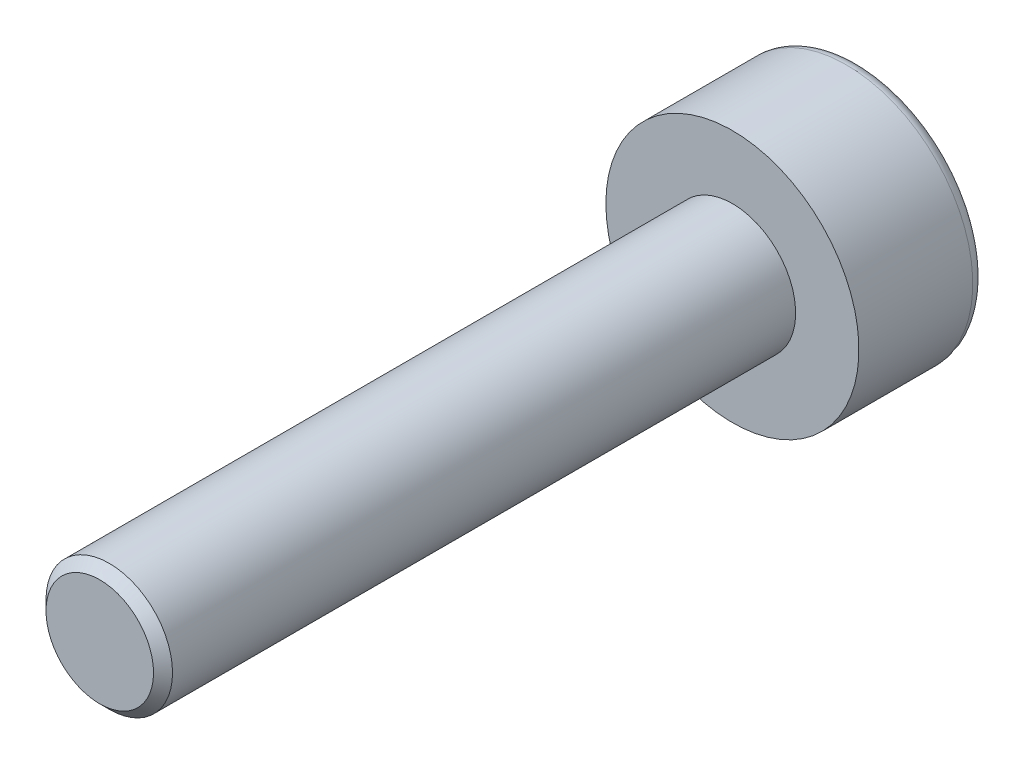
ISO-10303-21;
HEADER;
FILE_DESCRIPTION(('STEP AP214'),'2;1');
FILE_NAME('part.step','',(''),(''),'','','');
FILE_SCHEMA(('AUTOMOTIVE_DESIGN { 1 0 10303 214 1 1 1 1 }'));
ENDSEC;
DATA;
#1=APPLICATION_CONTEXT('core data for automotive mechanical design processes');
#2=APPLICATION_PROTOCOL_DEFINITION('international standard','automotive_design',2000,#1);
#3=PRODUCT_CONTEXT('',#1,'mechanical');
#4=PRODUCT('Part','Part','',(#3));
#5=PRODUCT_RELATED_PRODUCT_CATEGORY('part','',(#4));
#6=PRODUCT_DEFINITION_FORMATION('','',#4);
#7=PRODUCT_DEFINITION_CONTEXT('part definition',#1,'design');
#8=PRODUCT_DEFINITION('design','',#6,#7);
#9=PRODUCT_DEFINITION_SHAPE('','',#8);
#10=(LENGTH_UNIT() NAMED_UNIT(*) SI_UNIT(.MILLI.,.METRE.));
#11=(NAMED_UNIT(*) PLANE_ANGLE_UNIT() SI_UNIT($,.RADIAN.));
#12=(NAMED_UNIT(*) SI_UNIT($,.STERADIAN.) SOLID_ANGLE_UNIT());
#13=UNCERTAINTY_MEASURE_WITH_UNIT(LENGTH_MEASURE(1.E-05),#10,'distance_accuracy_value','');
#14=(GEOMETRIC_REPRESENTATION_CONTEXT(3) GLOBAL_UNCERTAINTY_ASSIGNED_CONTEXT((#13)) GLOBAL_UNIT_ASSIGNED_CONTEXT((#10,
#11,#12)) REPRESENTATION_CONTEXT('',''));
#15=CARTESIAN_POINT('',(0.,0.,0.));
#16=DIRECTION('',(0.,0.,1.));
#17=DIRECTION('',(1.,0.,0.));
#18=AXIS2_PLACEMENT_3D('',#15,#16,#17);
#19=CARTESIAN_POINT('',(0.,0.,10.));
#20=DIRECTION('',(0.,0.,-1.));
#21=DIRECTION('',(-1.,0.,0.));
#22=AXIS2_PLACEMENT_3D('',#19,#20,#21);
#23=CYLINDRICAL_SURFACE('',#22,1.);
#24=CARTESIAN_POINT('',(0.,0.,9.85));
#25=DIRECTION('',(0.,0.,1.));
#26=DIRECTION('',(1.,0.,0.));
#27=AXIS2_PLACEMENT_3D('',#24,#25,#26);
#28=CIRCLE('',#27,1.);
#29=CARTESIAN_POINT('',(1.,0.,9.85));
#30=VERTEX_POINT('',#29);
#31=EDGE_CURVE('E11',#30,#30,#28,.F.);
#32=ORIENTED_EDGE('',*,*,#31,.T.);
#33=EDGE_LOOP('',(#32));
#34=FACE_BOUND('',#33,.T.);
#35=CARTESIAN_POINT('',(0.,0.,0.));
#36=DIRECTION('',(0.,0.,-1.));
#37=DIRECTION('',(-1.,0.,0.));
#38=AXIS2_PLACEMENT_3D('',#35,#36,#37);
#39=CIRCLE('',#38,1.);
#40=CARTESIAN_POINT('',(-1.,0.,0.));
#41=VERTEX_POINT('',#40);
#42=EDGE_CURVE('E126',#41,#41,#39,.T.);
#43=ORIENTED_EDGE('',*,*,#42,.F.);
#44=EDGE_LOOP('',(#43));
#45=FACE_BOUND('',#44,.T.);
#46=ADVANCED_FACE('F17',(#34,#45),#23,.T.);
#47=CARTESIAN_POINT('',(0.,0.,10.));
#48=DIRECTION('',(0.,0.,1.));
#49=DIRECTION('',(1.,0.,0.));
#50=AXIS2_PLACEMENT_3D('',#47,#48,#49);
#51=PLANE('',#50);
#52=CARTESIAN_POINT('',(0.,0.,10.));
#53=DIRECTION('',(0.,0.,1.));
#54=DIRECTION('',(1.,0.,0.));
#55=AXIS2_PLACEMENT_3D('',#52,#53,#54);
#56=CIRCLE('',#55,0.85);
#57=CARTESIAN_POINT('',(0.85,0.,10.));
#58=VERTEX_POINT('',#57);
#59=EDGE_CURVE('E25',#58,#58,#56,.T.);
#60=ORIENTED_EDGE('',*,*,#59,.T.);
#61=EDGE_LOOP('',(#60));
#62=FACE_BOUND('',#61,.T.);
#63=ADVANCED_FACE('F139',(#62),#51,.T.);
#64=CARTESIAN_POINT('',(0.,0.,-2.));
#65=DIRECTION('',(0.,0.,1.));
#66=DIRECTION('',(1.,0.,0.));
#67=AXIS2_PLACEMENT_3D('',#64,#65,#66);
#68=CYLINDRICAL_SURFACE('',#67,2.);
#69=CARTESIAN_POINT('',(0.,0.,-1.8));
#70=DIRECTION('',(0.,0.,-1.));
#71=DIRECTION('',(-1.,0.,0.));
#72=AXIS2_PLACEMENT_3D('',#69,#70,#71);
#73=CIRCLE('',#72,2.);
#74=CARTESIAN_POINT('',(-2.,0.,-1.8));
#75=VERTEX_POINT('',#74);
#76=EDGE_CURVE('E132',#75,#75,#73,.F.);
#77=ORIENTED_EDGE('',*,*,#76,.T.);
#78=EDGE_LOOP('',(#77));
#79=FACE_BOUND('',#78,.T.);
#80=CARTESIAN_POINT('',(0.,0.,0.));
#81=DIRECTION('',(0.,0.,-1.));
#82=DIRECTION('',(-1.,0.,0.));
#83=AXIS2_PLACEMENT_3D('',#80,#81,#82);
#84=CIRCLE('',#83,2.);
#85=CARTESIAN_POINT('',(-2.,0.,0.));
#86=VERTEX_POINT('',#85);
#87=EDGE_CURVE('E118',#86,#86,#84,.T.);
#88=ORIENTED_EDGE('',*,*,#87,.T.);
#89=EDGE_LOOP('',(#88));
#90=FACE_BOUND('',#89,.T.);
#91=ADVANCED_FACE('F160',(#79,#90),#68,.T.);
#92=CARTESIAN_POINT('',(0.,0.,-2.));
#93=DIRECTION('',(0.,0.,-1.));
#94=DIRECTION('',(-1.,0.,0.));
#95=AXIS2_PLACEMENT_3D('',#92,#93,#94);
#96=PLANE('',#95);
#97=CARTESIAN_POINT('',(0.,0.,-2.));
#98=DIRECTION('',(0.,0.,-1.));
#99=DIRECTION('',(-1.,0.,0.));
#100=AXIS2_PLACEMENT_3D('',#97,#98,#99);
#101=CIRCLE('',#100,1.8);
#102=CARTESIAN_POINT('',(-1.8,0.,-2.));
#103=VERTEX_POINT('',#102);
#104=EDGE_CURVE('E129',#103,#103,#101,.T.);
#105=ORIENTED_EDGE('',*,*,#104,.T.);
#106=EDGE_LOOP('',(#105));
#107=FACE_BOUND('',#106,.T.);
#108=DIRECTION('',(-0.5,0.866025403784439,0.));
#109=VECTOR('',#108,1.);
#110=CARTESIAN_POINT('',(-0.43301270189222,-0.75,-2.));
#111=LINE('',#110,#109);
#112=CARTESIAN_POINT('',(-0.43301270189222,-0.75,-2.));
#113=VERTEX_POINT('',#112);
#114=CARTESIAN_POINT('',(-0.866025403784438,0.,-2.));
#115=VERTEX_POINT('',#114);
#116=EDGE_CURVE('E32',#113,#115,#111,.T.);
#117=ORIENTED_EDGE('',*,*,#116,.F.);
#118=DIRECTION('',(-1.,0.,0.));
#119=VECTOR('',#118,1.);
#120=CARTESIAN_POINT('',(0.433012701892218,-0.75,-2.));
#121=LINE('',#120,#119);
#122=CARTESIAN_POINT('',(0.433012701892218,-0.75,-2.));
#123=VERTEX_POINT('',#122);
#124=EDGE_CURVE('E113',#123,#113,#121,.T.);
#125=ORIENTED_EDGE('',*,*,#124,.F.);
#126=DIRECTION('',(-0.5,-0.866025403784439,0.));
#127=VECTOR('',#126,1.);
#128=CARTESIAN_POINT('',(0.866025403784438,0.,-2.));
#129=LINE('',#128,#127);
#130=CARTESIAN_POINT('',(0.866025403784438,0.,-2.));
#131=VERTEX_POINT('',#130);
#132=EDGE_CURVE('E114',#131,#123,#129,.T.);
#133=ORIENTED_EDGE('',*,*,#132,.F.);
#134=DIRECTION('',(0.5,-0.866025403784439,0.));
#135=VECTOR('',#134,1.);
#136=CARTESIAN_POINT('',(0.43301270189222,0.75,-2.));
#137=LINE('',#136,#135);
#138=CARTESIAN_POINT('',(0.43301270189222,0.75,-2.));
#139=VERTEX_POINT('',#138);
#140=EDGE_CURVE('E79',#139,#131,#137,.T.);
#141=ORIENTED_EDGE('',*,*,#140,.F.);
#142=DIRECTION('',(1.,0.,0.));
#143=VECTOR('',#142,1.);
#144=CARTESIAN_POINT('',(-0.43301270189222,0.75,-2.));
#145=LINE('',#144,#143);
#146=CARTESIAN_POINT('',(-0.43301270189222,0.75,-2.));
#147=VERTEX_POINT('',#146);
#148=EDGE_CURVE('E108',#147,#139,#145,.T.);
#149=ORIENTED_EDGE('',*,*,#148,.F.);
#150=DIRECTION('',(0.5,0.866025403784439,0.));
#151=VECTOR('',#150,1.);
#152=CARTESIAN_POINT('',(-0.866025403784439,0.,-2.));
#153=LINE('',#152,#151);
#154=EDGE_CURVE('E106',#115,#147,#153,.T.);
#155=ORIENTED_EDGE('',*,*,#154,.F.);
#156=EDGE_LOOP('',(#117,#125,#133,#141,#149,#155));
#157=FACE_BOUND('',#156,.T.);
#158=ADVANCED_FACE('F162',(#107,#157),#96,.T.);
#159=CARTESIAN_POINT('',(0.,0.,0.));
#160=DIRECTION('',(0.,0.,-1.));
#161=DIRECTION('',(-1.,0.,0.));
#162=AXIS2_PLACEMENT_3D('',#159,#160,#161);
#163=PLANE('',#162);
#164=ORIENTED_EDGE('',*,*,#42,.T.);
#165=EDGE_LOOP('',(#164));
#166=FACE_BOUND('',#165,.T.);
#167=ORIENTED_EDGE('',*,*,#87,.F.);
#168=EDGE_LOOP('',(#167));
#169=FACE_BOUND('',#168,.T.);
#170=ADVANCED_FACE('F164',(#166,#169),#163,.F.);
#171=CARTESIAN_POINT('',(-0.43301270189222,-0.75,-1.));
#172=DIRECTION('',(-0.866025403784439,-0.5,0.));
#173=DIRECTION('',(0.5,-0.866025403784439,0.));
#174=AXIS2_PLACEMENT_3D('',#171,#172,#173);
#175=PLANE('',#174);
#176=ORIENTED_EDGE('',*,*,#116,.T.);
#177=DIRECTION('',(0.,0.,-1.));
#178=VECTOR('',#177,1.);
#179=CARTESIAN_POINT('',(-0.866025403784439,0.,-1.));
#180=LINE('',#179,#178);
#181=CARTESIAN_POINT('',(-0.866025403784439,0.,-1.));
#182=VERTEX_POINT('',#181);
#183=EDGE_CURVE('E62',#182,#115,#180,.T.);
#184=ORIENTED_EDGE('',*,*,#183,.F.);
#185=DIRECTION('',(-0.5,0.866025403784439,0.));
#186=VECTOR('',#185,1.);
#187=CARTESIAN_POINT('',(-0.43301270189222,-0.75,-1.));
#188=LINE('',#187,#186);
#189=CARTESIAN_POINT('',(-0.43301270189222,-0.75,-1.));
#190=VERTEX_POINT('',#189);
#191=EDGE_CURVE('E117',#190,#182,#188,.T.);
#192=ORIENTED_EDGE('',*,*,#191,.F.);
#193=DIRECTION('',(0.,0.,-1.));
#194=VECTOR('',#193,1.);
#195=CARTESIAN_POINT('',(-0.43301270189222,-0.75,-1.));
#196=LINE('',#195,#194);
#197=EDGE_CURVE('E37',#190,#113,#196,.T.);
#198=ORIENTED_EDGE('',*,*,#197,.T.);
#199=EDGE_LOOP('',(#176,#184,#192,#198));
#200=FACE_BOUND('',#199,.T.);
#201=ADVANCED_FACE('F169',(#200),#175,.F.);
#202=CARTESIAN_POINT('',(0.433012701892218,-0.75,-1.));
#203=DIRECTION('',(0.,-1.,0.));
#204=DIRECTION('',(1.,0.,0.));
#205=AXIS2_PLACEMENT_3D('',#202,#203,#204);
#206=PLANE('',#205);
#207=ORIENTED_EDGE('',*,*,#124,.T.);
#208=ORIENTED_EDGE('',*,*,#197,.F.);
#209=DIRECTION('',(-1.,0.,0.));
#210=VECTOR('',#209,1.);
#211=CARTESIAN_POINT('',(0.433012701892218,-0.75,-1.));
#212=LINE('',#211,#210);
#213=CARTESIAN_POINT('',(0.433012701892218,-0.75,-1.));
#214=VERTEX_POINT('',#213);
#215=EDGE_CURVE('E95',#214,#190,#212,.T.);
#216=ORIENTED_EDGE('',*,*,#215,.F.);
#217=DIRECTION('',(0.,0.,-1.));
#218=VECTOR('',#217,1.);
#219=CARTESIAN_POINT('',(0.433012701892218,-0.75,-1.));
#220=LINE('',#219,#218);
#221=EDGE_CURVE('E81',#214,#123,#220,.T.);
#222=ORIENTED_EDGE('',*,*,#221,.T.);
#223=EDGE_LOOP('',(#207,#208,#216,#222));
#224=FACE_BOUND('',#223,.T.);
#225=ADVANCED_FACE('F175',(#224),#206,.F.);
#226=CARTESIAN_POINT('',(0.866025403784438,0.,-1.));
#227=DIRECTION('',(0.866025403784439,-0.5,0.));
#228=DIRECTION('',(0.5,0.866025403784439,0.));
#229=AXIS2_PLACEMENT_3D('',#226,#227,#228);
#230=PLANE('',#229);
#231=ORIENTED_EDGE('',*,*,#132,.T.);
#232=ORIENTED_EDGE('',*,*,#221,.F.);
#233=DIRECTION('',(-0.5,-0.866025403784439,0.));
#234=VECTOR('',#233,1.);
#235=CARTESIAN_POINT('',(0.866025403784438,0.,-1.));
#236=LINE('',#235,#234);
#237=CARTESIAN_POINT('',(0.866025403784438,0.,-1.));
#238=VERTEX_POINT('',#237);
#239=EDGE_CURVE('E86',#238,#214,#236,.T.);
#240=ORIENTED_EDGE('',*,*,#239,.F.);
#241=DIRECTION('',(0.,0.,-1.));
#242=VECTOR('',#241,1.);
#243=CARTESIAN_POINT('',(0.866025403784438,0.,-1.));
#244=LINE('',#243,#242);
#245=EDGE_CURVE('E73',#238,#131,#244,.T.);
#246=ORIENTED_EDGE('',*,*,#245,.T.);
#247=EDGE_LOOP('',(#231,#232,#240,#246));
#248=FACE_BOUND('',#247,.T.);
#249=ADVANCED_FACE('F90',(#248),#230,.F.);
#250=CARTESIAN_POINT('',(0.43301270189222,0.75,-1.));
#251=DIRECTION('',(0.866025403784439,0.5,0.));
#252=DIRECTION('',(-0.5,0.866025403784439,0.));
#253=AXIS2_PLACEMENT_3D('',#250,#251,#252);
#254=PLANE('',#253);
#255=ORIENTED_EDGE('',*,*,#140,.T.);
#256=ORIENTED_EDGE('',*,*,#245,.F.);
#257=DIRECTION('',(0.5,-0.866025403784439,0.));
#258=VECTOR('',#257,1.);
#259=CARTESIAN_POINT('',(0.43301270189222,0.75,-1.));
#260=LINE('',#259,#258);
#261=CARTESIAN_POINT('',(0.43301270189222,0.75,-1.));
#262=VERTEX_POINT('',#261);
#263=EDGE_CURVE('E80',#262,#238,#260,.T.);
#264=ORIENTED_EDGE('',*,*,#263,.F.);
#265=DIRECTION('',(0.,0.,-1.));
#266=VECTOR('',#265,1.);
#267=CARTESIAN_POINT('',(0.43301270189222,0.75,-1.));
#268=LINE('',#267,#266);
#269=EDGE_CURVE('E83',#262,#139,#268,.T.);
#270=ORIENTED_EDGE('',*,*,#269,.T.);
#271=EDGE_LOOP('',(#255,#256,#264,#270));
#272=FACE_BOUND('',#271,.T.);
#273=ADVANCED_FACE('F74',(#272),#254,.F.);
#274=CARTESIAN_POINT('',(-0.43301270189222,0.75,-1.));
#275=DIRECTION('',(0.,1.,0.));
#276=DIRECTION('',(-1.,0.,0.));
#277=AXIS2_PLACEMENT_3D('',#274,#275,#276);
#278=PLANE('',#277);
#279=ORIENTED_EDGE('',*,*,#148,.T.);
#280=ORIENTED_EDGE('',*,*,#269,.F.);
#281=DIRECTION('',(1.,0.,0.));
#282=VECTOR('',#281,1.);
#283=CARTESIAN_POINT('',(-0.43301270189222,0.75,-1.));
#284=LINE('',#283,#282);
#285=CARTESIAN_POINT('',(-0.43301270189222,0.75,-1.));
#286=VERTEX_POINT('',#285);
#287=EDGE_CURVE('E98',#286,#262,#284,.T.);
#288=ORIENTED_EDGE('',*,*,#287,.F.);
#289=DIRECTION('',(0.,0.,-1.));
#290=VECTOR('',#289,1.);
#291=CARTESIAN_POINT('',(-0.43301270189222,0.75,-1.));
#292=LINE('',#291,#290);
#293=EDGE_CURVE('E121',#286,#147,#292,.T.);
#294=ORIENTED_EDGE('',*,*,#293,.T.);
#295=EDGE_LOOP('',(#279,#280,#288,#294));
#296=FACE_BOUND('',#295,.T.);
#297=ADVANCED_FACE('F178',(#296),#278,.F.);
#298=CARTESIAN_POINT('',(-0.866025403784439,0.,-1.));
#299=DIRECTION('',(-0.866025403784439,0.5,0.));
#300=DIRECTION('',(-0.5,-0.866025403784439,0.));
#301=AXIS2_PLACEMENT_3D('',#298,#299,#300);
#302=PLANE('',#301);
#303=ORIENTED_EDGE('',*,*,#154,.T.);
#304=ORIENTED_EDGE('',*,*,#293,.F.);
#305=DIRECTION('',(0.5,0.866025403784439,0.));
#306=VECTOR('',#305,1.);
#307=CARTESIAN_POINT('',(-0.866025403784439,0.,-1.));
#308=LINE('',#307,#306);
#309=EDGE_CURVE('E99',#182,#286,#308,.T.);
#310=ORIENTED_EDGE('',*,*,#309,.F.);
#311=ORIENTED_EDGE('',*,*,#183,.T.);
#312=EDGE_LOOP('',(#303,#304,#310,#311));
#313=FACE_BOUND('',#312,.T.);
#314=ADVANCED_FACE('F179',(#313),#302,.F.);
#315=CARTESIAN_POINT('',(0.,0.,-1.));
#316=DIRECTION('',(0.,0.,-1.));
#317=DIRECTION('',(-1.,0.,0.));
#318=AXIS2_PLACEMENT_3D('',#315,#316,#317);
#319=PLANE('',#318);
#320=ORIENTED_EDGE('',*,*,#191,.T.);
#321=ORIENTED_EDGE('',*,*,#309,.T.);
#322=ORIENTED_EDGE('',*,*,#287,.T.);
#323=ORIENTED_EDGE('',*,*,#263,.T.);
#324=ORIENTED_EDGE('',*,*,#239,.T.);
#325=ORIENTED_EDGE('',*,*,#215,.T.);
#326=EDGE_LOOP('',(#320,#321,#322,#323,#324,#325));
#327=FACE_BOUND('',#326,.T.);
#328=ADVANCED_FACE('F92',(#327),#319,.T.);
#329=CARTESIAN_POINT('',(0.,0.,-1.8));
#330=DIRECTION('',(0.,0.,-1.));
#331=DIRECTION('',(-1.,0.,0.));
#332=AXIS2_PLACEMENT_3D('',#329,#330,#331);
#333=TOROIDAL_SURFACE('',#332,1.8,0.2);
#334=ORIENTED_EDGE('',*,*,#76,.F.);
#335=EDGE_LOOP('',(#334));
#336=FACE_BOUND('',#335,.T.);
#337=ORIENTED_EDGE('',*,*,#104,.F.);
#338=EDGE_LOOP('',(#337));
#339=FACE_BOUND('',#338,.T.);
#340=ADVANCED_FACE('F143',(#336,#339),#333,.T.);
#341=CARTESIAN_POINT('',(0.,0.,10.));
#342=DIRECTION('',(0.,0.,-1.));
#343=DIRECTION('',(-1.,0.,0.));
#344=AXIS2_PLACEMENT_3D('',#341,#342,#343);
#345=CONICAL_SURFACE('',#344,0.85,0.785398163397446);
#346=ORIENTED_EDGE('',*,*,#31,.F.);
#347=EDGE_LOOP('',(#346));
#348=FACE_BOUND('',#347,.T.);
#349=ORIENTED_EDGE('',*,*,#59,.F.);
#350=EDGE_LOOP('',(#349));
#351=FACE_BOUND('',#350,.T.);
#352=ADVANCED_FACE('F19',(#348,#351),#345,.T.);
#353=CLOSED_SHELL('',(#46,#63,#91,#158,#170,#201,#225,#249,#273,#297,#314,#328,#340,#352));
#354=MANIFOLD_SOLID_BREP('B1',#353);
#355=ADVANCED_BREP_SHAPE_REPRESENTATION('',(#18,#354),#14);
#356=SHAPE_DEFINITION_REPRESENTATION(#9,#355);
ENDSEC;
END-ISO-10303-21;
